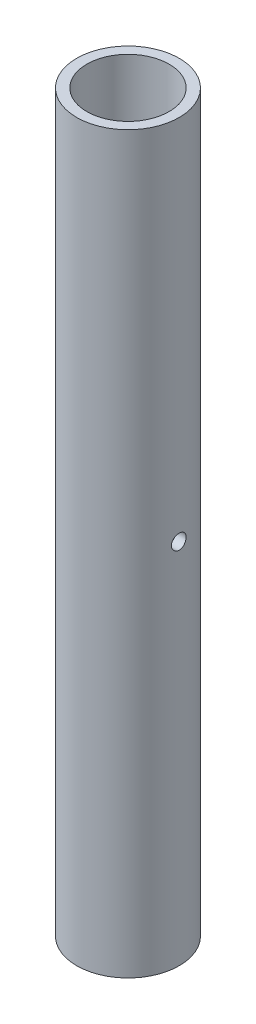
ISO-10303-21;
HEADER;
FILE_DESCRIPTION(('STEP AP214'),'2;1');
FILE_NAME('part.step','',(''),(''),'','','');
FILE_SCHEMA(('AUTOMOTIVE_DESIGN { 1 0 10303 214 1 1 1 1 }'));
ENDSEC;
DATA;
#1=APPLICATION_CONTEXT('core data for automotive mechanical design processes');
#2=APPLICATION_PROTOCOL_DEFINITION('international standard','automotive_design',2000,#1);
#3=PRODUCT_CONTEXT('',#1,'mechanical');
#4=PRODUCT('Part','Part','',(#3));
#5=PRODUCT_RELATED_PRODUCT_CATEGORY('part','',(#4));
#6=PRODUCT_DEFINITION_FORMATION('','',#4);
#7=PRODUCT_DEFINITION_CONTEXT('part definition',#1,'design');
#8=PRODUCT_DEFINITION('design','',#6,#7);
#9=PRODUCT_DEFINITION_SHAPE('','',#8);
#10=(LENGTH_UNIT() NAMED_UNIT(*) SI_UNIT(.MILLI.,.METRE.));
#11=(NAMED_UNIT(*) PLANE_ANGLE_UNIT() SI_UNIT($,.RADIAN.));
#12=(NAMED_UNIT(*) SI_UNIT($,.STERADIAN.) SOLID_ANGLE_UNIT());
#13=UNCERTAINTY_MEASURE_WITH_UNIT(LENGTH_MEASURE(1.E-05),#10,'distance_accuracy_value','');
#14=(GEOMETRIC_REPRESENTATION_CONTEXT(3) GLOBAL_UNCERTAINTY_ASSIGNED_CONTEXT((#13)) GLOBAL_UNIT_ASSIGNED_CONTEXT((#10,
#11,#12)) REPRESENTATION_CONTEXT('',''));
#15=CARTESIAN_POINT('',(0.,0.,0.));
#16=DIRECTION('',(0.,0.,1.));
#17=DIRECTION('',(1.,0.,0.));
#18=AXIS2_PLACEMENT_3D('',#15,#16,#17);
#19=CARTESIAN_POINT('',(0.,-250.,0.));
#20=DIRECTION('',(0.,1.,0.));
#21=DIRECTION('',(0.,0.,1.));
#22=AXIS2_PLACEMENT_3D('',#19,#20,#21);
#23=CYLINDRICAL_SURFACE('',#22,17.45);
#24=CARTESIAN_POINT('',(-17.45,-122.5,0.));
#25=CARTESIAN_POINT('',(-17.449997833609,-122.500005813199,-0.139659069131431));
#26=CARTESIAN_POINT('',(-17.4483057717418,-122.511742288432,-0.27940096953609));
#27=CARTESIAN_POINT('',(-17.4417186219199,-122.558369057046,-0.554983780799083));
#28=CARTESIAN_POINT('',(-17.436820350462,-122.59328236361,-0.690820674218128));
#29=CARTESIAN_POINT('',(-17.424371627989,-122.685202394939,-0.954564947499616));
#30=CARTESIAN_POINT('',(-17.4168231194134,-122.742192941777,-1.08247805438664));
#31=CARTESIAN_POINT('',(-17.3999095852699,-122.876611304284,-1.32690439029663));
#32=CARTESIAN_POINT('',(-17.3905448289335,-122.954036091495,-1.44341930508465));
#33=CARTESIAN_POINT('',(-17.3709664886444,-123.127715688061,-1.66259609430243));
#34=CARTESIAN_POINT('',(-17.3607478606969,-123.224087717809,-1.76516464040465));
#35=CARTESIAN_POINT('',(-17.3406532956682,-123.432674002354,-1.95273231948699));
#36=CARTESIAN_POINT('',(-17.3307773776495,-123.544889136637,-2.03773047645087));
#37=CARTESIAN_POINT('',(-17.3124373449939,-123.782597741048,-2.18810364094725));
#38=CARTESIAN_POINT('',(-17.3039797459275,-123.908148384378,-2.25338913303157));
#39=CARTESIAN_POINT('',(-17.2895022578095,-124.168573913845,-2.3619118194634));
#40=CARTESIAN_POINT('',(-17.2834822476269,-124.303448336266,-2.4051501094291));
#41=CARTESIAN_POINT('',(-17.274610802817,-124.577714627511,-2.46806285751546));
#42=CARTESIAN_POINT('',(-17.2717379691438,-124.717069271071,-2.48789652617558));
#43=CARTESIAN_POINT('',(-17.2694210606716,-124.997156209543,-2.50393008582493));
#44=CARTESIAN_POINT('',(-17.2699768060186,-125.137888431803,-2.5001312165121));
#45=CARTESIAN_POINT('',(-17.2744346880879,-125.415615342819,-2.46913781028681));
#46=CARTESIAN_POINT('',(-17.278311541498,-125.552630221315,-2.44212003198174));
#47=CARTESIAN_POINT('',(-17.2889353425072,-125.820161499612,-2.36573217987321));
#48=CARTESIAN_POINT('',(-17.2956823647492,-125.950677730307,-2.31636152474838));
#49=CARTESIAN_POINT('',(-17.3113144307329,-126.202047878269,-2.19648377630887));
#50=CARTESIAN_POINT('',(-17.320207081256,-126.322865333184,-2.12590125806106));
#51=CARTESIAN_POINT('',(-17.3391228293591,-126.55100833164,-1.96565714417655));
#52=CARTESIAN_POINT('',(-17.3491459946886,-126.658333065772,-1.87599440481317));
#53=CARTESIAN_POINT('',(-17.3693053327107,-126.857468944192,-1.67916210556577));
#54=CARTESIAN_POINT('',(-17.3794417028889,-126.949129810444,-1.57184046156677));
#55=CARTESIAN_POINT('',(-17.3986003451384,-127.113161253329,-1.34325667458433));
#56=CARTESIAN_POINT('',(-17.4076226130734,-127.185531758345,-1.22199447984782));
#57=CARTESIAN_POINT('',(-17.4235447450989,-127.308933677292,-0.96884564471254));
#58=CARTESIAN_POINT('',(-17.4304435179015,-127.359954124017,-0.836953585293493));
#59=CARTESIAN_POINT('',(-17.441332047367,-127.439080265312,-0.566352842533664));
#60=CARTESIAN_POINT('',(-17.4453219832817,-127.467187371886,-0.427644579790962));
#61=CARTESIAN_POINT('',(-17.4499196708866,-127.499490598639,-0.148646527587762));
#62=CARTESIAN_POINT('',(-17.4505566616317,-127.503893437473,-0.00838113636611034));
#63=CARTESIAN_POINT('',(-17.4484560936687,-127.489210937023,0.270885813358834));
#64=CARTESIAN_POINT('',(-17.4457186300103,-127.470126259322,0.409887407348976));
#65=CARTESIAN_POINT('',(-17.4371948404663,-127.409182329122,0.68205950346201));
#66=CARTESIAN_POINT('',(-17.4314219183416,-127.367423174692,0.815252874942938));
#67=CARTESIAN_POINT('',(-17.417472688609,-127.262420809866,1.07274730483414));
#68=CARTESIAN_POINT('',(-17.4092962768242,-127.199176668204,1.19704797750807));
#69=CARTESIAN_POINT('',(-17.3913767332945,-127.052510284026,1.4341416626749));
#70=CARTESIAN_POINT('',(-17.3816235077272,-126.968956166961,1.54685232078544));
#71=CARTESIAN_POINT('',(-17.3616690380562,-126.784226070965,1.756724996173));
#72=CARTESIAN_POINT('',(-17.3514677703339,-126.683049162207,1.85388619249818));
#73=CARTESIAN_POINT('',(-17.3316749537202,-126.465027953172,2.03064872982673));
#74=CARTESIAN_POINT('',(-17.3220885907384,-126.348071112272,2.1101119297161));
#75=CARTESIAN_POINT('',(-17.3047009905486,-126.102348583748,2.24826429468659));
#76=CARTESIAN_POINT('',(-17.2968997085118,-125.973583192787,2.30695398147288));
#77=CARTESIAN_POINT('',(-17.2840025230464,-125.708320328084,2.40167647445549));
#78=CARTESIAN_POINT('',(-17.2788977708991,-125.571849791631,2.43778345894843));
#79=CARTESIAN_POINT('',(-17.2719475858838,-125.294703625582,2.48655255471416));
#80=CARTESIAN_POINT('',(-17.2701019493106,-125.15402825936,2.49921613127768));
#81=CARTESIAN_POINT('',(-17.269886110116,-124.873841768445,2.50070635732498));
#82=CARTESIAN_POINT('',(-17.2714842483363,-124.734331774152,2.48975014677459));
#83=CARTESIAN_POINT('',(-17.2779072977888,-124.459159594933,2.44477554758208));
#84=CARTESIAN_POINT('',(-17.2827322055965,-124.323497405924,2.41075718341444));
#85=CARTESIAN_POINT('',(-17.2950544454013,-124.059922974401,2.32069823101196));
#86=CARTESIAN_POINT('',(-17.3025500975677,-123.932005919428,2.26467148322988));
#87=CARTESIAN_POINT('',(-17.3193714878851,-123.687352519329,2.13220760960367));
#88=CARTESIAN_POINT('',(-17.3286972769633,-123.570616485472,2.05576991576418));
#89=CARTESIAN_POINT('',(-17.3482304425876,-123.350533509368,1.88386003361371));
#90=CARTESIAN_POINT('',(-17.3584448379142,-123.247313065403,1.78822668014983));
#91=CARTESIAN_POINT('',(-17.3785447310215,-123.05830683465,1.58098030031121));
#92=CARTESIAN_POINT('',(-17.3884301515271,-122.97252512032,1.46936355169145));
#93=CARTESIAN_POINT('',(-17.4068143220839,-122.820452382221,1.23266573312442));
#94=CARTESIAN_POINT('',(-17.4153058905528,-122.754260971436,1.10752012289331));
#95=CARTESIAN_POINT('',(-17.4298747133881,-122.643933813528,0.847828651271736));
#96=CARTESIAN_POINT('',(-17.4359545023606,-122.59977489919,0.713292834160892));
#97=CARTESIAN_POINT('',(-17.4436044333333,-122.544943940505,0.481771497795642));
#98=CARTESIAN_POINT('',(-17.445990637109,-122.528115272597,0.386224588665811));
#99=CARTESIAN_POINT('',(-17.4491891636135,-122.505641345889,0.193798407060501));
#100=CARTESIAN_POINT('',(-17.4500015034095,-122.499995965817,0.0969191490445933));
#101=CARTESIAN_POINT('',(-17.45,-122.5,0.));
#102=B_SPLINE_CURVE_WITH_KNOTS('',3,(#24,#25,#26,#27,#28,#29,#30,#31,#32,#33,#34,#35,#36,#37,
#38,#39,#40,#41,#42,#43,#44,#45,#46,#47,#48,#49,#50,#51,#52,#53,#54,#55,#56,#57,#58,#59,#60,#61,
#62,#63,#64,#65,#66,#67,#68,#69,#70,#71,#72,#73,#74,#75,#76,#77,#78,#79,#80,#81,#82,#83,#84,#85,
#86,#87,#88,#89,#90,#91,#92,#93,#94,#95,#96,#97,#98,#99,#100,#101),.UNSPECIFIED.,.T.,.F.,(4,2,2,
2,2,2,2,2,2,2,2,2,2,2,2,2,2,2,2,2,2,2,2,2,2,2,2,2,2,2,2,2,2,2,2,2,2,2,4),(0.,0.418623095032038,
0.837662480300858,1.25639537779091,1.67506625177178,2.09641379298883,2.51778473332338,
2.9410413026885,3.36427683660441,3.78461639191026,4.204933897545,4.62207971265903,
5.03923637692287,5.45789427521329,5.87657727620848,6.29907548903476,6.72157527039902,
7.14429181797614,7.56698231423849,7.98598059515673,8.40496707423129,8.8221187705194,
9.23928855053353,9.65924301665749,10.0792196474539,10.502367670737,10.9255050663433,
11.347245163796,11.7689589002042,12.1868123067866,12.6046652699271,13.0222558767089,
13.4398581054042,13.8611253415745,14.2824908433322,14.7059634829881,15.1289898969107,
15.4195047512122,15.7100164551299),.UNSPECIFIED.);
#103=CARTESIAN_POINT('',(-17.45,-122.5,0.));
#104=VERTEX_POINT('',#103);
#105=EDGE_CURVE('E10',#104,#104,#102,.T.);
#106=ORIENTED_EDGE('',*,*,#105,.F.);
#107=EDGE_LOOP('',(#106));
#108=FACE_BOUND('',#107,.T.);
#109=CARTESIAN_POINT('',(17.2699884192202,-125.,-2.49999999999999));
#110=CARTESIAN_POINT('',(17.2699906700957,-124.860349222677,-2.49999417964548));
#111=CARTESIAN_POINT('',(17.2717006294794,-124.720615591199,-2.48825905096343));
#112=CARTESIAN_POINT('',(17.2783516696973,-124.445049957514,-2.44163811644041));
#113=CARTESIAN_POINT('',(17.2832959665398,-124.30922197931,-2.40672926769443));
#114=CARTESIAN_POINT('',(17.2958444371735,-124.045496567665,-2.31482227391431));
#115=CARTESIAN_POINT('',(17.3034466370928,-123.917593331724,-2.25784051778013));
#116=CARTESIAN_POINT('',(17.3204519870499,-123.673183572525,-2.12344286428692));
#117=CARTESIAN_POINT('',(17.3298548719862,-123.556675375468,-2.0460299742197));
#118=CARTESIAN_POINT('',(17.349479042744,-123.337491154421,-1.87236246009537));
#119=CARTESIAN_POINT('',(17.3597052775671,-123.234910550387,-1.7759879520091));
#120=CARTESIAN_POINT('',(17.3797796495088,-123.047319555247,-1.56739162749962));
#121=CARTESIAN_POINT('',(17.3896277663983,-122.962310103123,-1.45516896470935));
#122=CARTESIAN_POINT('',(17.4078877863405,-122.811925004667,-1.21745361153159));
#123=CARTESIAN_POINT('',(17.4162932212316,-122.746636832864,-1.091905043242));
#124=CARTESIAN_POINT('',(17.4306661084296,-122.638108621911,-0.831484018550056));
#125=CARTESIAN_POINT('',(17.4366336784989,-122.594867517738,-0.696612012890206));
#126=CARTESIAN_POINT('',(17.4454235522337,-122.531949069658,-0.422353743869643));
#127=CARTESIAN_POINT('',(17.4482671389467,-122.512112208106,-0.283004769062756));
#128=CARTESIAN_POINT('',(17.4505615218279,-122.496070297873,-0.00292897602713343));
#129=CARTESIAN_POINT('',(17.4500124908175,-122.499864045439,0.13779777165265));
#130=CARTESIAN_POINT('',(17.4456005650384,-122.53084921913,0.415546937899407));
#131=CARTESIAN_POINT('',(17.4417619746957,-122.557869047242,0.552588940348106));
#132=CARTESIAN_POINT('',(17.4312293445286,-122.634270352877,0.82017340331789));
#133=CARTESIAN_POINT('',(17.424535236532,-122.683652364273,0.950715708582944));
#134=CARTESIAN_POINT('',(17.4090018733181,-122.803553876838,1.20211794255558));
#135=CARTESIAN_POINT('',(17.4001552485319,-122.874146195007,1.32294266871779));
#136=CARTESIAN_POINT('',(17.381303911319,-123.034411360172,1.5510960785885));
#137=CARTESIAN_POINT('',(17.3712991292824,-123.124085354326,1.6584239502714));
#138=CARTESIAN_POINT('',(17.3511423946113,-123.320925793909,1.85754758026959));
#139=CARTESIAN_POINT('',(17.3409899269637,-123.428241987036,1.9491953186531));
#140=CARTESIAN_POINT('',(17.3217699334829,-123.656810135681,2.113202849021));
#141=CARTESIAN_POINT('',(17.3127024132685,-123.778062163362,2.18556254111899));
#142=CARTESIAN_POINT('',(17.2966792278577,-124.031207921804,2.30895661523192));
#143=CARTESIAN_POINT('',(17.2897249744946,-124.163108692649,2.35997674922329));
#144=CARTESIAN_POINT('',(17.2787413803952,-124.433728418079,2.43909961050927));
#145=CARTESIAN_POINT('',(17.274711852449,-124.572446935657,2.46720380465314));
#146=CARTESIAN_POINT('',(17.270069125874,-124.851450263159,2.49949601568935));
#147=CARTESIAN_POINT('',(17.269426017722,-124.9917103579,2.50389342382887));
#148=CARTESIAN_POINT('',(17.2715496287525,-125.270965422381,2.48920195223855));
#149=CARTESIAN_POINT('',(17.2743162517158,-125.40996042771,2.47011373524992));
#150=CARTESIAN_POINT('',(17.2829201759858,-125.682097157464,2.40917008643165));
#151=CARTESIAN_POINT('',(17.2887435169935,-125.815262535084,2.36741813253414));
#152=CARTESIAN_POINT('',(17.3027932836378,-126.072704150661,2.26243951038767));
#153=CARTESIAN_POINT('',(17.3110198182981,-126.196979985016,2.19921186784846));
#154=CARTESIAN_POINT('',(17.3290198614878,-126.434055924846,2.05257022421396));
#155=CARTESIAN_POINT('',(17.3388036359794,-126.546771082754,1.96902016971507));
#156=CARTESIAN_POINT('',(17.3587844941479,-126.756654720722,1.78429542601093));
#157=CARTESIAN_POINT('',(17.3689815990636,-126.853822400601,1.6831198302336));
#158=CARTESIAN_POINT('',(17.388733193526,-127.030600125836,1.46509597037586));
#159=CARTESIAN_POINT('',(17.3982822360595,-127.110071737777,1.34813489628504));
#160=CARTESIAN_POINT('',(17.4155780950753,-127.248238846436,1.1024015453183));
#161=CARTESIAN_POINT('',(17.4233249572759,-127.306934870215,0.973629568180618));
#162=CARTESIAN_POINT('',(17.4361196462015,-127.401661310504,0.708369910739525));
#163=CARTESIAN_POINT('',(17.4411766237855,-127.437768647463,0.571910159295824));
#164=CARTESIAN_POINT('',(17.4480600592334,-127.486542098361,0.294786834398643));
#165=CARTESIAN_POINT('',(17.4498867109459,-127.499209618901,0.154123513712339));
#166=CARTESIAN_POINT('',(17.4501020348807,-127.500711829836,-0.126068842496541));
#167=CARTESIAN_POINT('',(17.4485213287242,-127.489758795662,-0.265596763190437));
#168=CARTESIAN_POINT('',(17.4421610263954,-127.444784263737,-0.540805614619138));
#169=CARTESIAN_POINT('',(17.4373814379203,-127.410762821493,-0.676486554609837));
#170=CARTESIAN_POINT('',(17.4251578684848,-127.320690116899,-0.940100311878765));
#171=CARTESIAN_POINT('',(17.4177155107067,-127.264652273365,-1.06803779401927));
#172=CARTESIAN_POINT('',(17.4009857409017,-127.132159849092,-1.31272745268777));
#173=CARTESIAN_POINT('',(17.3916982796454,-127.055704723577,-1.42947933064807));
#174=CARTESIAN_POINT('',(17.372212619974,-126.883775093156,-1.64956275965082));
#175=CARTESIAN_POINT('',(17.3620073087598,-126.78814344541,-1.75277093088837));
#176=CARTESIAN_POINT('',(17.3418900445272,-126.580905603635,-1.94175319343921));
#177=CARTESIAN_POINT('',(17.3319781610562,-126.469295658483,-2.027523179426));
#178=CARTESIAN_POINT('',(17.3135159357748,-126.232603940265,-2.17958261066714));
#179=CARTESIAN_POINT('',(17.3049727931516,-126.107456384792,-2.24577050884666));
#180=CARTESIAN_POINT('',(17.290299637642,-125.847760914935,-2.35609056867584));
#181=CARTESIAN_POINT('',(17.2841670872327,-125.713223061984,-2.40024593625506));
#182=CARTESIAN_POINT('',(17.276447204345,-125.481711104173,-2.45506739474629));
#183=CARTESIAN_POINT('',(17.2740377744681,-125.386176270582,-2.47189179342364));
#184=CARTESIAN_POINT('',(17.2708076098865,-125.193774246926,-2.4943600525109));
#185=CARTESIAN_POINT('',(17.269986857283,-125.096907071884,-2.50000403888558));
#186=CARTESIAN_POINT('',(17.2699884192202,-125.,-2.49999999999999));
#187=B_SPLINE_CURVE_WITH_KNOTS('',3,(#109,#110,#111,#112,#113,#114,#115,#116,#117,#118,#119,
#120,#121,#122,#123,#124,#125,#126,#127,#128,#129,#130,#131,#132,#133,#134,#135,#136,#137,#138,
#139,#140,#141,#142,#143,#144,#145,#146,#147,#148,#149,#150,#151,#152,#153,#154,#155,#156,#157,
#158,#159,#160,#161,#162,#163,#164,#165,#166,#167,#168,#169,#170,#171,#172,#173,#174,#175,#176,
#177,#178,#179,#180,#181,#182,#183,#184,#185,#186),.UNSPECIFIED.,.T.,.F.,(4,2,2,2,2,2,2,2,2,2,2,
2,2,2,2,2,2,2,2,2,2,2,2,2,2,2,2,2,2,2,2,2,2,2,2,2,2,2,4),(0.,0.418598182334508,
0.837613224602592,1.25631774713278,1.67496067420167,2.0963408253999,2.51774348882402,
2.9409887444532,3.36421355253938,3.78453678587647,4.20483860794366,4.62206160336462,
5.03929456007132,5.45797660961434,5.87668383673075,6.29914833494593,6.72161502092214,
7.14436333144326,7.56708457972127,7.98606593142509,8.40503546015905,8.8221079565663,
9.23919937688131,9.65916392960747,10.0791500896482,10.5023145282641,10.9254682307419,
11.3471730254976,11.7688525133091,12.186758214375,12.6046629098682,13.0223132900462,
13.4399748151014,13.8612100865011,14.2825444112704,14.706026825732,15.1290622576302,
15.4195409929497,15.7100164555548),.UNSPECIFIED.);
#188=CARTESIAN_POINT('',(17.2699884192202,-125.,-2.49999999999999));
#189=VERTEX_POINT('',#188);
#190=EDGE_CURVE('E48',#189,#189,#187,.T.);
#191=ORIENTED_EDGE('',*,*,#190,.F.);
#192=EDGE_LOOP('',(#191));
#193=FACE_BOUND('',#192,.T.);
#194=CARTESIAN_POINT('',(0.,-250.,0.));
#195=DIRECTION('',(0.,1.,0.));
#196=DIRECTION('',(0.,0.,1.));
#197=AXIS2_PLACEMENT_3D('',#194,#195,#196);
#198=CIRCLE('',#197,17.45);
#199=CARTESIAN_POINT('',(0.,-250.,17.45));
#200=VERTEX_POINT('',#199);
#201=EDGE_CURVE('E52',#200,#200,#198,.T.);
#202=ORIENTED_EDGE('',*,*,#201,.T.);
#203=EDGE_LOOP('',(#202));
#204=FACE_BOUND('',#203,.T.);
#205=CARTESIAN_POINT('',(0.,0.,0.));
#206=DIRECTION('',(0.,1.,0.));
#207=DIRECTION('',(0.,0.,1.));
#208=AXIS2_PLACEMENT_3D('',#205,#206,#207);
#209=CIRCLE('',#208,17.45);
#210=CARTESIAN_POINT('',(0.,0.,17.45));
#211=VERTEX_POINT('',#210);
#212=EDGE_CURVE('E56',#211,#211,#209,.T.);
#213=ORIENTED_EDGE('',*,*,#212,.F.);
#214=EDGE_LOOP('',(#213));
#215=FACE_BOUND('',#214,.T.);
#216=ADVANCED_FACE('F37',(#108,#193,#204,#215),#23,.T.);
#217=CARTESIAN_POINT('',(0.,-250.,0.));
#218=DIRECTION('',(0.,1.,0.));
#219=DIRECTION('',(0.,0.,1.));
#220=AXIS2_PLACEMENT_3D('',#217,#218,#219);
#221=PLANE('',#220);
#222=CARTESIAN_POINT('',(0.,-250.,0.));
#223=DIRECTION('',(0.,1.,0.));
#224=DIRECTION('',(0.,0.,1.));
#225=AXIS2_PLACEMENT_3D('',#222,#223,#224);
#226=CIRCLE('',#225,14.);
#227=CARTESIAN_POINT('',(0.,-250.,14.));
#228=VERTEX_POINT('',#227);
#229=EDGE_CURVE('E87',#228,#228,#226,.T.);
#230=ORIENTED_EDGE('',*,*,#229,.T.);
#231=EDGE_LOOP('',(#230));
#232=FACE_BOUND('',#231,.T.);
#233=ORIENTED_EDGE('',*,*,#201,.F.);
#234=EDGE_LOOP('',(#233));
#235=FACE_BOUND('',#234,.T.);
#236=ADVANCED_FACE('F97',(#232,#235),#221,.F.);
#237=CARTESIAN_POINT('',(0.,0.,0.));
#238=DIRECTION('',(0.,1.,0.));
#239=DIRECTION('',(0.,0.,1.));
#240=AXIS2_PLACEMENT_3D('',#237,#238,#239);
#241=PLANE('',#240);
#242=CARTESIAN_POINT('',(0.,0.,0.));
#243=DIRECTION('',(0.,1.,0.));
#244=DIRECTION('',(0.,0.,1.));
#245=AXIS2_PLACEMENT_3D('',#242,#243,#244);
#246=CIRCLE('',#245,14.);
#247=CARTESIAN_POINT('',(0.,0.,14.));
#248=VERTEX_POINT('',#247);
#249=EDGE_CURVE('E86',#248,#248,#246,.T.);
#250=ORIENTED_EDGE('',*,*,#249,.F.);
#251=EDGE_LOOP('',(#250));
#252=FACE_BOUND('',#251,.T.);
#253=ORIENTED_EDGE('',*,*,#212,.T.);
#254=EDGE_LOOP('',(#253));
#255=FACE_BOUND('',#254,.T.);
#256=ADVANCED_FACE('F94',(#252,#255),#241,.T.);
#257=CARTESIAN_POINT('',(0.,-250.,0.));
#258=DIRECTION('',(0.,1.,0.));
#259=DIRECTION('',(0.,0.,1.));
#260=AXIS2_PLACEMENT_3D('',#257,#258,#259);
#261=CYLINDRICAL_SURFACE('',#260,14.);
#262=CARTESIAN_POINT('',(-13.7749773139559,-125.,-2.49999999999999));
#263=CARTESIAN_POINT('',(-13.7749799387038,-125.139219633012,-2.4999945411629));
#264=CARTESIAN_POINT('',(-13.7771107908789,-125.27851154187,-2.48833131153941));
#265=CARTESIAN_POINT('',(-13.7853946199968,-125.553176265414,-2.4420130413507));
#266=CARTESIAN_POINT('',(-13.7915511402329,-125.688545517757,-2.40733774573405));
#267=CARTESIAN_POINT('',(-13.8071672988197,-125.951350660636,-2.31608691728921));
#268=CARTESIAN_POINT('',(-13.8166239998033,-126.07879348773,-2.25953085486461));
#269=CARTESIAN_POINT('',(-13.8377715156682,-126.322371087812,-2.12617418313793));
#270=CARTESIAN_POINT('',(-13.8494621222548,-126.43850691357,-2.04937546105772));
#271=CARTESIAN_POINT('',(-13.873907770039,-126.657496927778,-1.87678833540928));
#272=CARTESIAN_POINT('',(-13.8866723857643,-126.760204817065,-1.78081562712205));
#273=CARTESIAN_POINT('',(-13.9117430255489,-126.948150528926,-1.57300318552242));
#274=CARTESIAN_POINT('',(-13.9240490207841,-127.033387254952,-1.46116245702622));
#275=CARTESIAN_POINT('',(-13.9469179106052,-127.184526710267,-1.22383338523176));
#276=CARTESIAN_POINT('',(-13.9574682193538,-127.250292271137,-1.09825637183168));
#277=CARTESIAN_POINT('',(-13.9755301011882,-127.359739742686,-0.837616772802043));
#278=CARTESIAN_POINT('',(-13.9830419008821,-127.403423300271,-0.702554895423173));
#279=CARTESIAN_POINT('',(-13.9941127759412,-127.467016490045,-0.428293673644153));
#280=CARTESIAN_POINT('',(-13.997712773247,-127.487172417043,-0.28915311684408));
#281=CARTESIAN_POINT('',(-14.0006952718093,-127.503904927246,-0.00942173772766847));
#282=CARTESIAN_POINT('',(-14.0000781001693,-127.500483339233,0.131168971263461));
#283=CARTESIAN_POINT('',(-13.9947279617152,-127.470348245803,0.408122988432862));
#284=CARTESIAN_POINT('',(-13.9900418473477,-127.443899876401,0.544516181052064));
#285=CARTESIAN_POINT('',(-13.9771327520065,-127.368880512089,0.810897015102341));
#286=CARTESIAN_POINT('',(-13.9689096512162,-127.320308767739,0.940884439369605));
#287=CARTESIAN_POINT('',(-13.9497715520927,-127.202164014084,1.19154151829011));
#288=CARTESIAN_POINT('',(-13.9388428375475,-127.132483577918,1.31215944836133));
#289=CARTESIAN_POINT('',(-13.9155046200703,-126.974178361061,1.54009014093526));
#290=CARTESIAN_POINT('',(-13.9030949801311,-126.885551826977,1.64740167052526));
#291=CARTESIAN_POINT('',(-13.8779680889456,-126.690404888012,1.8472424092631));
#292=CARTESIAN_POINT('',(-13.8652489602259,-126.583652612162,1.93954509991399));
#293=CARTESIAN_POINT('',(-13.8411025662894,-126.356060791827,2.10496786240998));
#294=CARTESIAN_POINT('',(-13.8296753166704,-126.235221077289,2.17808770266065));
#295=CARTESIAN_POINT('',(-13.8094045266784,-125.982600952103,2.30312479829602));
#296=CARTESIAN_POINT('',(-13.8005646973667,-125.850805171754,2.35501164183289));
#297=CARTESIAN_POINT('',(-13.7865283348087,-125.580174187589,2.43584403060095));
#298=CARTESIAN_POINT('',(-13.7813314298779,-125.441339703476,2.46479191631385));
#299=CARTESIAN_POINT('',(-13.7752421770154,-125.162607904559,2.49859916205465));
#300=CARTESIAN_POINT('',(-13.7742918793935,-125.02275115305,2.50378283673312));
#301=CARTESIAN_POINT('',(-13.776648684601,-124.744169662984,2.49078161816557));
#302=CARTESIAN_POINT('',(-13.7799555974406,-124.605444874188,2.47259776776006));
#303=CARTESIAN_POINT('',(-13.7904004323731,-124.334115417732,2.4136552586584));
#304=CARTESIAN_POINT('',(-13.7975098617234,-124.201473097393,2.37306442666377));
#305=CARTESIAN_POINT('',(-13.8147344144981,-123.944872687796,2.27063733511701));
#306=CARTESIAN_POINT('',(-13.824849741264,-123.820915186745,2.20879963822381));
#307=CARTESIAN_POINT('',(-13.847079502443,-123.583767873532,2.06487935022984));
#308=CARTESIAN_POINT('',(-13.8592138527616,-123.470705091531,1.98259057596104));
#309=CARTESIAN_POINT('',(-13.8840574336727,-123.259875744834,1.80038422344424));
#310=CARTESIAN_POINT('',(-13.896766710884,-123.162110423433,1.70046521371052));
#311=CARTESIAN_POINT('',(-13.9215130679047,-122.983451685284,1.48439134339207));
#312=CARTESIAN_POINT('',(-13.9335402120035,-122.902775580385,1.36805548621628));
#313=CARTESIAN_POINT('',(-13.9554035273845,-122.762113937578,1.12329296566843));
#314=CARTESIAN_POINT('',(-13.9652397773074,-122.702127656978,0.994866736508672));
#315=CARTESIAN_POINT('',(-13.9815700956849,-122.604879481443,0.730189348324159));
#316=CARTESIAN_POINT('',(-13.9880802890981,-122.567507783422,0.593979571421844));
#317=CARTESIAN_POINT('',(-13.9970934930076,-122.51619771652,0.317090343286914));
#318=CARTESIAN_POINT('',(-13.9995968842815,-122.502257120909,0.176411318075575));
#319=CARTESIAN_POINT('',(-14.0003078168069,-122.498276573053,-0.103333169371389));
#320=CARTESIAN_POINT('',(-13.9985745411226,-122.507907348864,-0.242393904292866));
#321=CARTESIAN_POINT('',(-13.9911289095657,-122.550078966739,-0.516882556055421));
#322=CARTESIAN_POINT('',(-13.9854165844658,-122.582619631626,-0.652310500982766));
#323=CARTESIAN_POINT('',(-13.9706535216891,-122.669553936971,-0.91553649749665));
#324=CARTESIAN_POINT('',(-13.9616076667541,-122.723915625728,-1.04334539246557));
#325=CARTESIAN_POINT('',(-13.9411603934573,-122.85291069311,-1.28807790386464));
#326=CARTESIAN_POINT('',(-13.9297588372901,-122.927545257753,-1.40500088290236));
#327=CARTESIAN_POINT('',(-13.9056730650892,-123.096115988713,-1.6262914777391));
#328=CARTESIAN_POINT('',(-13.892974041367,-123.190291518827,-1.7304751643583));
#329=CARTESIAN_POINT('',(-13.8678219751628,-123.394771371964,-1.92167550896121));
#330=CARTESIAN_POINT('',(-13.8553689910715,-123.50507947263,-2.00868813488378));
#331=CARTESIAN_POINT('',(-13.8320070537405,-123.739781161184,-2.16374622415779));
#332=CARTESIAN_POINT('',(-13.8211117157455,-123.86428365262,-2.23162894316815));
#333=CARTESIAN_POINT('',(-13.8022610834653,-124.123075067656,-2.34540886935922));
#334=CARTESIAN_POINT('',(-13.7943029436204,-124.257354367638,-2.39132736832843));
#335=CARTESIAN_POINT('',(-13.7839341813702,-124.493406735213,-2.45025798781185));
#336=CARTESIAN_POINT('',(-13.7805947327216,-124.593775865911,-2.46888019081667));
#337=CARTESIAN_POINT('',(-13.7761153629215,-124.796083761968,-2.49375305438022));
#338=CARTESIAN_POINT('',(-13.7749753913445,-124.898022491287,-2.50000399856394));
#339=CARTESIAN_POINT('',(-13.7749773139559,-125.,-2.49999999999999));
#340=B_SPLINE_CURVE_WITH_KNOTS('',3,(#262,#263,#264,#265,#266,#267,#268,#269,#270,#271,#272,
#273,#274,#275,#276,#277,#278,#279,#280,#281,#282,#283,#284,#285,#286,#287,#288,#289,#290,#291,
#292,#293,#294,#295,#296,#297,#298,#299,#300,#301,#302,#303,#304,#305,#306,#307,#308,#309,#310,
#311,#312,#313,#314,#315,#316,#317,#318,#319,#320,#321,#322,#323,#324,#325,#326,#327,#328,#329,
#330,#331,#332,#333,#334,#335,#336,#337,#338,#339),.UNSPECIFIED.,.T.,.F.,(4,2,2,2,2,2,2,2,2,2,2,
2,2,2,2,2,2,2,2,2,2,2,2,2,2,2,2,2,2,2,2,2,2,2,2,2,2,2,4),(0.,0.417285836009302,0.83493945195107,
1.25222227420762,1.66946620696472,2.09093251520213,2.512425267948,2.93682027279777,
3.36118362098867,3.78106358503934,4.20091098159993,4.61598714610602,5.03107737256275,
5.44831662439172,5.86559450693786,6.28867984623345,6.71177029320065,7.13546462585334,
7.55911572303871,7.97696761802824,8.39480086586727,8.8095462197338,9.22431963646748,
9.64345757488928,10.0626295608598,10.4868484189541,10.9110520475064,11.333179112111,
11.7552660584073,12.1714905473979,12.5877118174953,13.003325840844,13.4189641839515,
13.8400311188065,14.2611968100937,14.6858441972247,15.110079099029,15.4157453666601,
15.7214046264677),.UNSPECIFIED.);
#341=CARTESIAN_POINT('',(-13.7749773139559,-125.,-2.49999999999999));
#342=VERTEX_POINT('',#341);
#343=EDGE_CURVE('E80',#342,#342,#340,.T.);
#344=ORIENTED_EDGE('',*,*,#343,.T.);
#345=EDGE_LOOP('',(#344));
#346=FACE_BOUND('',#345,.T.);
#347=CARTESIAN_POINT('',(13.7749773139559,-125.,-2.49999999999999));
#348=CARTESIAN_POINT('',(13.7749799387038,-124.860780366988,-2.4999945411629));
#349=CARTESIAN_POINT('',(13.7771107908789,-124.72148845813,-2.4883313115394));
#350=CARTESIAN_POINT('',(13.7853946199968,-124.446823734586,-2.44201304135069));
#351=CARTESIAN_POINT('',(13.7915511402329,-124.311454482243,-2.40733774573405));
#352=CARTESIAN_POINT('',(13.8071672988197,-124.048649339364,-2.31608691728921));
#353=CARTESIAN_POINT('',(13.8166239998033,-123.92120651227,-2.25953085486462));
#354=CARTESIAN_POINT('',(13.8377715156682,-123.677628912188,-2.12617418313793));
#355=CARTESIAN_POINT('',(13.8494621222548,-123.56149308643,-2.04937546105772));
#356=CARTESIAN_POINT('',(13.873907770039,-123.342503072222,-1.87678833540928));
#357=CARTESIAN_POINT('',(13.8866723857643,-123.239795182935,-1.78081562712206));
#358=CARTESIAN_POINT('',(13.9117430255489,-123.051849471074,-1.57300318552243));
#359=CARTESIAN_POINT('',(13.9240490207841,-122.966612745048,-1.46116245702623));
#360=CARTESIAN_POINT('',(13.9469179106052,-122.815473289733,-1.22383338523177));
#361=CARTESIAN_POINT('',(13.9574682193538,-122.749707728863,-1.09825637183169));
#362=CARTESIAN_POINT('',(13.9755301011882,-122.640260257314,-0.837616772802055));
#363=CARTESIAN_POINT('',(13.9830419008821,-122.596576699729,-0.702554895423185));
#364=CARTESIAN_POINT('',(13.9941127759412,-122.532983509955,-0.428293673644164));
#365=CARTESIAN_POINT('',(13.997712773247,-122.512827582956,-0.289153116844091));
#366=CARTESIAN_POINT('',(14.0006952718093,-122.496095072754,-0.00942173772767747));
#367=CARTESIAN_POINT('',(14.0000781001693,-122.499516660767,0.131168971263454));
#368=CARTESIAN_POINT('',(13.9947279617152,-122.529651754197,0.408122988432855));
#369=CARTESIAN_POINT('',(13.9900418473477,-122.556100123599,0.544516181052057));
#370=CARTESIAN_POINT('',(13.9771327520065,-122.631119487911,0.810897015102337));
#371=CARTESIAN_POINT('',(13.9689096512162,-122.679691232261,0.940884439369605));
#372=CARTESIAN_POINT('',(13.9497715520927,-122.797835985916,1.19154151829011));
#373=CARTESIAN_POINT('',(13.9388428375475,-122.867516422082,1.31215944836132));
#374=CARTESIAN_POINT('',(13.9155046200703,-123.025821638939,1.54009014093525));
#375=CARTESIAN_POINT('',(13.9030949801311,-123.114448173023,1.64740167052526));
#376=CARTESIAN_POINT('',(13.8779680889456,-123.309595111988,1.8472424092631));
#377=CARTESIAN_POINT('',(13.8652489602259,-123.416347387838,1.93954509991399));
#378=CARTESIAN_POINT('',(13.8411025662894,-123.643939208173,2.10496786240998));
#379=CARTESIAN_POINT('',(13.8296753166704,-123.764778922711,2.17808770266065));
#380=CARTESIAN_POINT('',(13.8094045266784,-124.017399047897,2.30312479829603));
#381=CARTESIAN_POINT('',(13.8005646973667,-124.149194828246,2.35501164183289));
#382=CARTESIAN_POINT('',(13.7865283348087,-124.419825812411,2.43584403060095));
#383=CARTESIAN_POINT('',(13.7813314298779,-124.558660296524,2.46479191631385));
#384=CARTESIAN_POINT('',(13.7752421770154,-124.837392095441,2.49859916205465));
#385=CARTESIAN_POINT('',(13.7742918793935,-124.97724884695,2.50378283673312));
#386=CARTESIAN_POINT('',(13.776648684601,-125.255830337016,2.49078161816557));
#387=CARTESIAN_POINT('',(13.7799555974406,-125.394555125812,2.47259776776007));
#388=CARTESIAN_POINT('',(13.7904004323731,-125.665884582268,2.4136552586584));
#389=CARTESIAN_POINT('',(13.7975098617234,-125.798526902607,2.37306442666376));
#390=CARTESIAN_POINT('',(13.8147344144981,-126.055127312204,2.270637335117));
#391=CARTESIAN_POINT('',(13.824849741264,-126.179084813255,2.2087996382238));
#392=CARTESIAN_POINT('',(13.847079502443,-126.416232126468,2.06487935022983));
#393=CARTESIAN_POINT('',(13.8592138527616,-126.529294908469,1.98259057596103));
#394=CARTESIAN_POINT('',(13.8840574336727,-126.740124255166,1.80038422344423));
#395=CARTESIAN_POINT('',(13.896766710884,-126.837889576567,1.70046521371052));
#396=CARTESIAN_POINT('',(13.9215130679047,-127.016548314716,1.48439134339208));
#397=CARTESIAN_POINT('',(13.9335402120035,-127.097224419615,1.36805548621629));
#398=CARTESIAN_POINT('',(13.9554035273845,-127.237886062422,1.12329296566844));
#399=CARTESIAN_POINT('',(13.9652397773074,-127.297872343022,0.994866736508674));
#400=CARTESIAN_POINT('',(13.9815700956849,-127.395120518557,0.73018934832416));
#401=CARTESIAN_POINT('',(13.9880802890981,-127.432492216578,0.593979571421847));
#402=CARTESIAN_POINT('',(13.9970934930076,-127.48380228348,0.317090343286917));
#403=CARTESIAN_POINT('',(13.9995968842815,-127.497742879091,0.176411318075576));
#404=CARTESIAN_POINT('',(14.0003078168069,-127.501723426947,-0.103333169371388));
#405=CARTESIAN_POINT('',(13.9985745411226,-127.492092651136,-0.242393904292863));
#406=CARTESIAN_POINT('',(13.9911289095657,-127.449921033261,-0.516882556055418));
#407=CARTESIAN_POINT('',(13.9854165844658,-127.417380368374,-0.652310500982764));
#408=CARTESIAN_POINT('',(13.9706535216891,-127.330446063029,-0.915536497496649));
#409=CARTESIAN_POINT('',(13.9616076667541,-127.276084374272,-1.04334539246557));
#410=CARTESIAN_POINT('',(13.9411603934573,-127.14708930689,-1.28807790386464));
#411=CARTESIAN_POINT('',(13.9297588372901,-127.072454742247,-1.40500088290236));
#412=CARTESIAN_POINT('',(13.9056730650892,-126.903884011287,-1.62629147773911));
#413=CARTESIAN_POINT('',(13.892974041367,-126.809708481173,-1.73047516435832));
#414=CARTESIAN_POINT('',(13.8678219751628,-126.605228628036,-1.92167550896122));
#415=CARTESIAN_POINT('',(13.8553689910715,-126.49492052737,-2.00868813488378));
#416=CARTESIAN_POINT('',(13.8320070537405,-126.260218838816,-2.16374622415778));
#417=CARTESIAN_POINT('',(13.8211117157455,-126.13571634738,-2.23162894316814));
#418=CARTESIAN_POINT('',(13.8022610834653,-125.876924932344,-2.34540886935922));
#419=CARTESIAN_POINT('',(13.7943029436204,-125.742645632362,-2.39132736832843));
#420=CARTESIAN_POINT('',(13.7839341813702,-125.506593264787,-2.45025798781186));
#421=CARTESIAN_POINT('',(13.7805947327216,-125.406224134089,-2.46888019081668));
#422=CARTESIAN_POINT('',(13.7761153629215,-125.203916238032,-2.49375305438023));
#423=CARTESIAN_POINT('',(13.7749753913445,-125.101977508713,-2.50000399856394));
#424=CARTESIAN_POINT('',(13.7749773139559,-125.,-2.49999999999999));
#425=B_SPLINE_CURVE_WITH_KNOTS('',3,(#347,#348,#349,#350,#351,#352,#353,#354,#355,#356,#357,
#358,#359,#360,#361,#362,#363,#364,#365,#366,#367,#368,#369,#370,#371,#372,#373,#374,#375,#376,
#377,#378,#379,#380,#381,#382,#383,#384,#385,#386,#387,#388,#389,#390,#391,#392,#393,#394,#395,
#396,#397,#398,#399,#400,#401,#402,#403,#404,#405,#406,#407,#408,#409,#410,#411,#412,#413,#414,
#415,#416,#417,#418,#419,#420,#421,#422,#423,#424),.UNSPECIFIED.,.T.,.F.,(4,2,2,2,2,2,2,2,2,2,2,
2,2,2,2,2,2,2,2,2,2,2,2,2,2,2,2,2,2,2,2,2,2,2,2,2,2,2,4),(0.,0.417285836009316,0.83493945195107,
1.25222227420763,1.66946620696472,2.09093251520213,2.51242526794798,2.93682027279776,
3.36118362098866,3.78106358503933,4.20091098159992,4.61598714610602,5.03107737256274,
5.44831662439171,5.86559450693785,6.28867984623347,6.71177029320065,7.13546462585333,
7.5591157230387,7.9769676180282,8.39480086586727,8.80954621973383,9.2243196364675,
9.6434575748893,10.0626295608598,10.4868484189541,10.9110520475064,11.333179112111,
11.7552660584073,12.1714905473979,12.5877118174953,13.003325840844,13.4189641839515,
13.8400311188066,14.2611968100938,14.6858441972247,15.110079099029,15.4157453666601,
15.7214046264677),.UNSPECIFIED.);
#426=CARTESIAN_POINT('',(13.7749773139559,-125.,-2.49999999999999));
#427=VERTEX_POINT('',#426);
#428=EDGE_CURVE('E75',#427,#427,#425,.T.);
#429=ORIENTED_EDGE('',*,*,#428,.T.);
#430=EDGE_LOOP('',(#429));
#431=FACE_BOUND('',#430,.T.);
#432=ORIENTED_EDGE('',*,*,#229,.F.);
#433=EDGE_LOOP('',(#432));
#434=FACE_BOUND('',#433,.T.);
#435=ORIENTED_EDGE('',*,*,#249,.T.);
#436=EDGE_LOOP('',(#435));
#437=FACE_BOUND('',#436,.T.);
#438=ADVANCED_FACE('F67',(#346,#431,#434,#437),#261,.F.);
#439=CARTESIAN_POINT('',(17.45,-125.,0.));
#440=DIRECTION('',(1.,0.,0.));
#441=DIRECTION('',(0.,0.,-1.));
#442=AXIS2_PLACEMENT_3D('',#439,#440,#441);
#443=CYLINDRICAL_SURFACE('',#442,2.49999999999999);
#444=ORIENTED_EDGE('',*,*,#190,.T.);
#445=EDGE_LOOP('',(#444));
#446=FACE_BOUND('',#445,.T.);
#447=ORIENTED_EDGE('',*,*,#428,.F.);
#448=EDGE_LOOP('',(#447));
#449=FACE_BOUND('',#448,.T.);
#450=ADVANCED_FACE('F66',(#446,#449),#443,.F.);
#451=ORIENTED_EDGE('',*,*,#105,.T.);
#452=EDGE_LOOP('',(#451));
#453=FACE_BOUND('',#452,.T.);
#454=ORIENTED_EDGE('',*,*,#343,.F.);
#455=EDGE_LOOP('',(#454));
#456=FACE_BOUND('',#455,.T.);
#457=ADVANCED_FACE('F62',(#453,#456),#443,.F.);
#458=CLOSED_SHELL('',(#216,#236,#256,#438,#450,#457));
#459=MANIFOLD_SOLID_BREP('B2',#458);
#460=ADVANCED_BREP_SHAPE_REPRESENTATION('',(#18,#459),#14);
#461=SHAPE_DEFINITION_REPRESENTATION(#9,#460);
ENDSEC;
END-ISO-10303-21;
